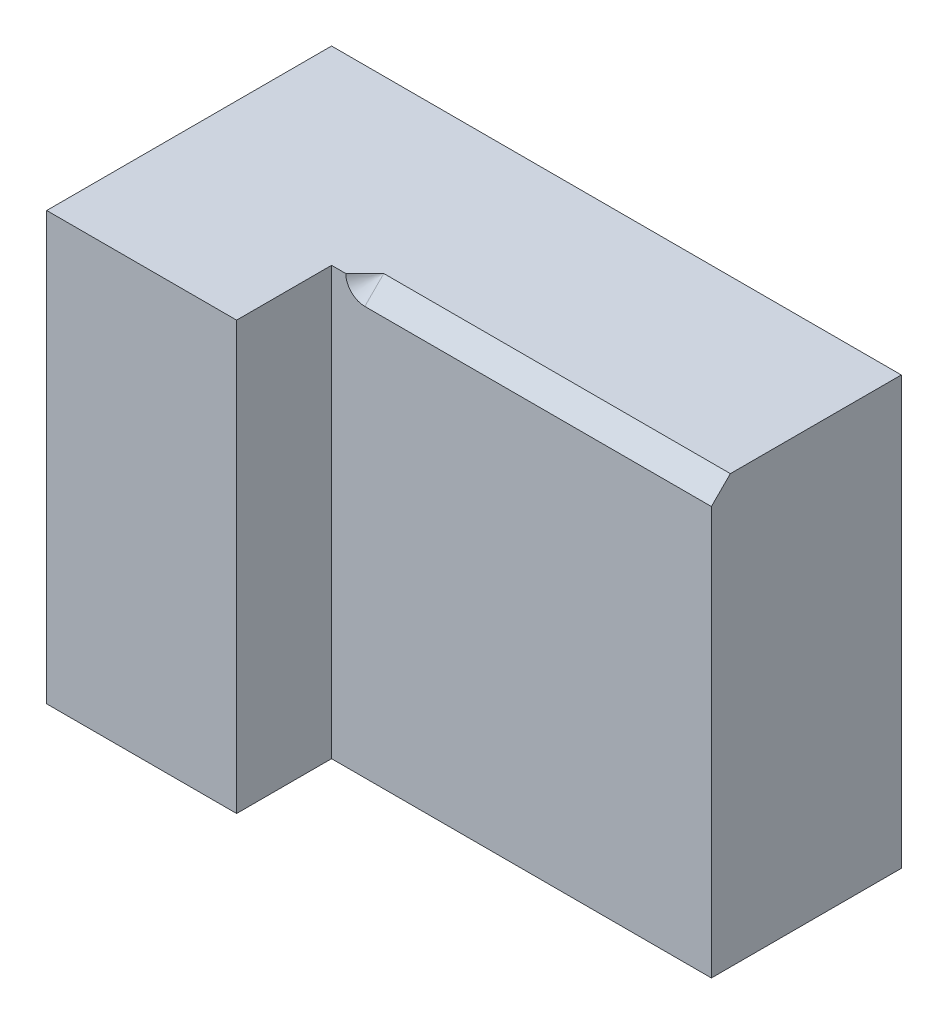
ISO-10303-21;
HEADER;
FILE_DESCRIPTION(('STEP AP214'),'2;1');
FILE_NAME('part.step','',(''),(''),'','','');
FILE_SCHEMA(('AUTOMOTIVE_DESIGN { 1 0 10303 214 1 1 1 1 }'));
ENDSEC;
DATA;
#1=APPLICATION_CONTEXT('core data for automotive mechanical design processes');
#2=APPLICATION_PROTOCOL_DEFINITION('international standard','automotive_design',2000,#1);
#3=PRODUCT_CONTEXT('',#1,'mechanical');
#4=PRODUCT('Part','Part','',(#3));
#5=PRODUCT_RELATED_PRODUCT_CATEGORY('part','',(#4));
#6=PRODUCT_DEFINITION_FORMATION('','',#4);
#7=PRODUCT_DEFINITION_CONTEXT('part definition',#1,'design');
#8=PRODUCT_DEFINITION('design','',#6,#7);
#9=PRODUCT_DEFINITION_SHAPE('','',#8);
#10=(LENGTH_UNIT() NAMED_UNIT(*) SI_UNIT(.MILLI.,.METRE.));
#11=(NAMED_UNIT(*) PLANE_ANGLE_UNIT() SI_UNIT($,.RADIAN.));
#12=(NAMED_UNIT(*) SI_UNIT($,.STERADIAN.) SOLID_ANGLE_UNIT());
#13=UNCERTAINTY_MEASURE_WITH_UNIT(LENGTH_MEASURE(1.E-05),#10,'distance_accuracy_value','');
#14=(GEOMETRIC_REPRESENTATION_CONTEXT(3) GLOBAL_UNCERTAINTY_ASSIGNED_CONTEXT((#13)) GLOBAL_UNIT_ASSIGNED_CONTEXT((#10,
#11,#12)) REPRESENTATION_CONTEXT('',''));
#15=CARTESIAN_POINT('',(0.,0.,0.));
#16=DIRECTION('',(0.,0.,1.));
#17=DIRECTION('',(1.,0.,0.));
#18=AXIS2_PLACEMENT_3D('',#15,#16,#17);
#19=CARTESIAN_POINT('',(0.,0.,20.));
#20=DIRECTION('',(0.,0.,-1.));
#21=DIRECTION('',(-1.,0.,0.));
#22=AXIS2_PLACEMENT_3D('',#19,#20,#21);
#23=PLANE('',#22);
#24=CARTESIAN_POINT('',(-6.5,20.5,20.));
#25=DIRECTION('',(1.,0.,0.));
#26=VECTOR('',#25,1.);
#27=LINE('',#24,#26);
#28=CARTESIAN_POINT('',(-6.5,20.5,20.));
#29=VERTEX_POINT('',#28);
#30=CARTESIAN_POINT('',(30.,20.5,20.));
#31=VERTEX_POINT('',#30);
#32=EDGE_CURVE('E208',#29,#31,#27,.T.);
#33=ORIENTED_EDGE('',*,*,#32,.F.);
#34=CARTESIAN_POINT('',(-6.5,22.5,20.));
#35=DIRECTION('',(0.,0.,-1.));
#36=DIRECTION('',(-1.,0.,0.));
#37=AXIS2_PLACEMENT_3D('',#34,#35,#36);
#38=CIRCLE('',#37,2.);
#39=CARTESIAN_POINT('',(-8.5,22.5,20.));
#40=VERTEX_POINT('',#39);
#41=EDGE_CURVE('E211',#29,#40,#38,.T.);
#42=ORIENTED_EDGE('',*,*,#41,.T.);
#43=DIRECTION('',(-1.,0.,0.));
#44=VECTOR('',#43,1.);
#45=CARTESIAN_POINT('',(-30.,22.5,20.));
#46=LINE('',#45,#44);
#47=CARTESIAN_POINT('',(-10.,22.5,20.));
#48=VERTEX_POINT('',#47);
#49=EDGE_CURVE('E150',#40,#48,#46,.T.);
#50=ORIENTED_EDGE('',*,*,#49,.T.);
#51=DIRECTION('',(0.,1.,0.));
#52=VECTOR('',#51,1.);
#53=CARTESIAN_POINT('',(-10.,-22.5,20.));
#54=LINE('',#53,#52);
#55=CARTESIAN_POINT('',(-10.,-22.5,20.));
#56=VERTEX_POINT('',#55);
#57=EDGE_CURVE('E70',#56,#48,#54,.T.);
#58=ORIENTED_EDGE('',*,*,#57,.F.);
#59=DIRECTION('',(1.,0.,0.));
#60=VECTOR('',#59,1.);
#61=CARTESIAN_POINT('',(-30.,-22.5,20.));
#62=LINE('',#61,#60);
#63=CARTESIAN_POINT('',(30.,-22.5,20.));
#64=VERTEX_POINT('',#63);
#65=EDGE_CURVE('E75',#56,#64,#62,.T.);
#66=ORIENTED_EDGE('',*,*,#65,.T.);
#67=DIRECTION('',(0.,1.,0.));
#68=VECTOR('',#67,1.);
#69=CARTESIAN_POINT('',(30.,-22.5,20.));
#70=LINE('',#69,#68);
#71=EDGE_CURVE('E123',#64,#31,#70,.T.);
#72=ORIENTED_EDGE('',*,*,#71,.T.);
#73=EDGE_LOOP('',(#33,#42,#50,#58,#66,#72));
#74=FACE_BOUND('',#73,.T.);
#75=ADVANCED_FACE('F47',(#74),#23,.F.);
#76=CARTESIAN_POINT('',(-30.,-22.5,20.));
#77=DIRECTION('',(1.,0.,0.));
#78=DIRECTION('',(0.,0.,-1.));
#79=AXIS2_PLACEMENT_3D('',#76,#77,#78);
#80=PLANE('',#79);
#81=DIRECTION('',(0.,-1.,0.));
#82=VECTOR('',#81,1.);
#83=CARTESIAN_POINT('',(-30.,-22.5,0.));
#84=LINE('',#83,#82);
#85=CARTESIAN_POINT('',(-30.,22.5,0.));
#86=VERTEX_POINT('',#85);
#87=CARTESIAN_POINT('',(-30.,-22.5,0.));
#88=VERTEX_POINT('',#87);
#89=EDGE_CURVE('E122',#86,#88,#84,.T.);
#90=ORIENTED_EDGE('',*,*,#89,.T.);
#91=DIRECTION('',(0.,0.,-1.));
#92=VECTOR('',#91,1.);
#93=CARTESIAN_POINT('',(-30.,-22.5,20.));
#94=LINE('',#93,#92);
#95=CARTESIAN_POINT('',(-30.,-22.5,30.));
#96=VERTEX_POINT('',#95);
#97=EDGE_CURVE('E13',#96,#88,#94,.T.);
#98=ORIENTED_EDGE('',*,*,#97,.F.);
#99=DIRECTION('',(0.,-1.,0.));
#100=VECTOR('',#99,1.);
#101=CARTESIAN_POINT('',(-30.,-22.5,30.));
#102=LINE('',#101,#100);
#103=CARTESIAN_POINT('',(-30.,22.5,30.));
#104=VERTEX_POINT('',#103);
#105=EDGE_CURVE('E250',#104,#96,#102,.T.);
#106=ORIENTED_EDGE('',*,*,#105,.F.);
#107=DIRECTION('',(0.,0.,-1.));
#108=VECTOR('',#107,1.);
#109=CARTESIAN_POINT('',(-30.,22.5,20.));
#110=LINE('',#109,#108);
#111=EDGE_CURVE('E110',#104,#86,#110,.T.);
#112=ORIENTED_EDGE('',*,*,#111,.T.);
#113=EDGE_LOOP('',(#90,#98,#106,#112));
#114=FACE_BOUND('',#113,.T.);
#115=ADVANCED_FACE('F51',(#114),#80,.F.);
#116=CARTESIAN_POINT('',(-30.,-22.5,20.));
#117=DIRECTION('',(0.,1.,0.));
#118=DIRECTION('',(0.,0.,1.));
#119=AXIS2_PLACEMENT_3D('',#116,#117,#118);
#120=PLANE('',#119);
#121=DIRECTION('',(1.,0.,0.));
#122=VECTOR('',#121,1.);
#123=CARTESIAN_POINT('',(-30.,-22.5,0.));
#124=LINE('',#123,#122);
#125=CARTESIAN_POINT('',(30.,-22.5,0.));
#126=VERTEX_POINT('',#125);
#127=EDGE_CURVE('E119',#88,#126,#124,.T.);
#128=ORIENTED_EDGE('',*,*,#127,.T.);
#129=DIRECTION('',(0.,0.,-1.));
#130=VECTOR('',#129,1.);
#131=CARTESIAN_POINT('',(30.,-22.5,20.));
#132=LINE('',#131,#130);
#133=EDGE_CURVE('E56',#64,#126,#132,.T.);
#134=ORIENTED_EDGE('',*,*,#133,.F.);
#135=ORIENTED_EDGE('',*,*,#65,.F.);
#136=DIRECTION('',(0.,0.,-1.));
#137=VECTOR('',#136,1.);
#138=CARTESIAN_POINT('',(-10.,-22.5,30.));
#139=LINE('',#138,#137);
#140=CARTESIAN_POINT('',(-10.,-22.5,30.));
#141=VERTEX_POINT('',#140);
#142=EDGE_CURVE('E148',#141,#56,#139,.T.);
#143=ORIENTED_EDGE('',*,*,#142,.F.);
#144=DIRECTION('',(1.,0.,0.));
#145=VECTOR('',#144,1.);
#146=CARTESIAN_POINT('',(-30.,-22.5,30.));
#147=LINE('',#146,#145);
#148=EDGE_CURVE('E251',#96,#141,#147,.T.);
#149=ORIENTED_EDGE('',*,*,#148,.F.);
#150=ORIENTED_EDGE('',*,*,#97,.T.);
#151=EDGE_LOOP('',(#128,#134,#135,#143,#149,#150));
#152=FACE_BOUND('',#151,.T.);
#153=ADVANCED_FACE('F178',(#152),#120,.F.);
#154=CARTESIAN_POINT('',(30.,-22.5,20.));
#155=DIRECTION('',(-1.,0.,0.));
#156=DIRECTION('',(0.,0.,1.));
#157=AXIS2_PLACEMENT_3D('',#154,#155,#156);
#158=PLANE('',#157);
#159=DIRECTION('',(0.,0.,-1.));
#160=VECTOR('',#159,1.);
#161=CARTESIAN_POINT('',(30.,22.5,20.));
#162=LINE('',#161,#160);
#163=CARTESIAN_POINT('',(30.,22.5,18.));
#164=VERTEX_POINT('',#163);
#165=CARTESIAN_POINT('',(30.,22.5,0.));
#166=VERTEX_POINT('',#165);
#167=EDGE_CURVE('E93',#164,#166,#162,.T.);
#168=ORIENTED_EDGE('',*,*,#167,.F.);
#169=DIRECTION('',(0.,-0.707106781186548,0.707106781186547));
#170=VECTOR('',#169,1.);
#171=CARTESIAN_POINT('',(30.,-1.00000000000004,41.5));
#172=LINE('',#171,#170);
#173=EDGE_CURVE('E225',#164,#31,#172,.T.);
#174=ORIENTED_EDGE('',*,*,#173,.T.);
#175=ORIENTED_EDGE('',*,*,#71,.F.);
#176=ORIENTED_EDGE('',*,*,#133,.T.);
#177=DIRECTION('',(0.,1.,0.));
#178=VECTOR('',#177,1.);
#179=CARTESIAN_POINT('',(30.,-22.5,0.));
#180=LINE('',#179,#178);
#181=EDGE_CURVE('E112',#126,#166,#180,.T.);
#182=ORIENTED_EDGE('',*,*,#181,.T.);
#183=EDGE_LOOP('',(#168,#174,#175,#176,#182));
#184=FACE_BOUND('',#183,.T.);
#185=ADVANCED_FACE('F115',(#184),#158,.F.);
#186=CARTESIAN_POINT('',(-30.,22.5,20.));
#187=DIRECTION('',(0.,-1.,0.));
#188=DIRECTION('',(0.,0.,-1.));
#189=AXIS2_PLACEMENT_3D('',#186,#187,#188);
#190=PLANE('',#189);
#191=ORIENTED_EDGE('',*,*,#49,.F.);
#192=DIRECTION('',(0.707106781186547,0.,-0.707106781186548));
#193=VECTOR('',#192,1.);
#194=CARTESIAN_POINT('',(-6.5,22.5,18.));
#195=LINE('',#194,#193);
#196=CARTESIAN_POINT('',(-6.5,22.5,18.));
#197=VERTEX_POINT('',#196);
#198=EDGE_CURVE('E52',#40,#197,#195,.T.);
#199=ORIENTED_EDGE('',*,*,#198,.T.);
#200=CARTESIAN_POINT('',(-6.5,22.5,18.));
#201=DIRECTION('',(1.,0.,0.));
#202=VECTOR('',#201,1.);
#203=LINE('',#200,#202);
#204=EDGE_CURVE('E105',#197,#164,#203,.T.);
#205=ORIENTED_EDGE('',*,*,#204,.T.);
#206=ORIENTED_EDGE('',*,*,#167,.T.);
#207=DIRECTION('',(-1.,0.,0.));
#208=VECTOR('',#207,1.);
#209=CARTESIAN_POINT('',(-30.,22.5,0.));
#210=LINE('',#209,#208);
#211=EDGE_CURVE('E100',#166,#86,#210,.T.);
#212=ORIENTED_EDGE('',*,*,#211,.T.);
#213=ORIENTED_EDGE('',*,*,#111,.F.);
#214=DIRECTION('',(-1.,0.,0.));
#215=VECTOR('',#214,1.);
#216=CARTESIAN_POINT('',(-30.,22.5,30.));
#217=LINE('',#216,#215);
#218=CARTESIAN_POINT('',(-10.,22.5,30.));
#219=VERTEX_POINT('',#218);
#220=EDGE_CURVE('E264',#219,#104,#217,.T.);
#221=ORIENTED_EDGE('',*,*,#220,.F.);
#222=DIRECTION('',(0.,0.,-1.));
#223=VECTOR('',#222,1.);
#224=CARTESIAN_POINT('',(-10.,22.5,30.));
#225=LINE('',#224,#223);
#226=EDGE_CURVE('E267',#219,#48,#225,.T.);
#227=ORIENTED_EDGE('',*,*,#226,.T.);
#228=EDGE_LOOP('',(#191,#199,#205,#206,#212,#213,#221,#227));
#229=FACE_BOUND('',#228,.T.);
#230=ADVANCED_FACE('F94',(#229),#190,.F.);
#231=CARTESIAN_POINT('',(0.,0.,0.));
#232=DIRECTION('',(0.,0.,-1.));
#233=DIRECTION('',(-1.,0.,0.));
#234=AXIS2_PLACEMENT_3D('',#231,#232,#233);
#235=PLANE('',#234);
#236=ORIENTED_EDGE('',*,*,#89,.F.);
#237=ORIENTED_EDGE('',*,*,#211,.F.);
#238=ORIENTED_EDGE('',*,*,#181,.F.);
#239=ORIENTED_EDGE('',*,*,#127,.F.);
#240=EDGE_LOOP('',(#236,#237,#238,#239));
#241=FACE_BOUND('',#240,.T.);
#242=ADVANCED_FACE('F118',(#241),#235,.T.);
#243=CARTESIAN_POINT('',(-10.,-22.5,30.));
#244=DIRECTION('',(-1.,0.,0.));
#245=DIRECTION('',(0.,0.,1.));
#246=AXIS2_PLACEMENT_3D('',#243,#244,#245);
#247=PLANE('',#246);
#248=ORIENTED_EDGE('',*,*,#57,.T.);
#249=ORIENTED_EDGE('',*,*,#226,.F.);
#250=DIRECTION('',(0.,1.,0.));
#251=VECTOR('',#250,1.);
#252=CARTESIAN_POINT('',(-10.,-22.5,30.));
#253=LINE('',#252,#251);
#254=EDGE_CURVE('E261',#141,#219,#253,.T.);
#255=ORIENTED_EDGE('',*,*,#254,.F.);
#256=ORIENTED_EDGE('',*,*,#142,.T.);
#257=EDGE_LOOP('',(#248,#249,#255,#256));
#258=FACE_BOUND('',#257,.T.);
#259=ADVANCED_FACE('F198',(#258),#247,.F.);
#260=CARTESIAN_POINT('',(0.,0.,30.));
#261=DIRECTION('',(0.,0.,-1.));
#262=DIRECTION('',(-1.,0.,0.));
#263=AXIS2_PLACEMENT_3D('',#260,#261,#262);
#264=PLANE('',#263);
#265=ORIENTED_EDGE('',*,*,#105,.T.);
#266=ORIENTED_EDGE('',*,*,#148,.T.);
#267=ORIENTED_EDGE('',*,*,#254,.T.);
#268=ORIENTED_EDGE('',*,*,#220,.T.);
#269=EDGE_LOOP('',(#265,#266,#267,#268));
#270=FACE_BOUND('',#269,.T.);
#271=ADVANCED_FACE('F298',(#270),#264,.F.);
#272=CARTESIAN_POINT('',(-6.5,20.5,20.));
#273=DIRECTION('',(0.,-0.707106781186547,-0.707106781186548));
#274=DIRECTION('',(0.,0.707106781186548,-0.707106781186547));
#275=AXIS2_PLACEMENT_3D('',#272,#273,#274);
#276=PLANE('',#275);
#277=ORIENTED_EDGE('',*,*,#204,.F.);
#278=DIRECTION('',(0.,0.707106781186548,-0.707106781186547));
#279=VECTOR('',#278,1.);
#280=CARTESIAN_POINT('',(-6.5,20.5,20.));
#281=LINE('',#280,#279);
#282=EDGE_CURVE('E218',#29,#197,#281,.T.);
#283=ORIENTED_EDGE('',*,*,#282,.F.);
#284=ORIENTED_EDGE('',*,*,#32,.T.);
#285=ORIENTED_EDGE('',*,*,#173,.F.);
#286=EDGE_LOOP('',(#277,#283,#284,#285));
#287=FACE_BOUND('',#286,.T.);
#288=ADVANCED_FACE('F303',(#287),#276,.F.);
#289=CARTESIAN_POINT('',(-6.5,22.5,18.));
#290=DIRECTION('',(0.,0.,1.));
#291=DIRECTION('',(1.,0.,0.));
#292=AXIS2_PLACEMENT_3D('',#289,#290,#291);
#293=CONICAL_SURFACE('',#292,0.,0.785398163397448);
#294=ORIENTED_EDGE('',*,*,#282,.T.);
#295=ORIENTED_EDGE('',*,*,#198,.F.);
#296=ORIENTED_EDGE('',*,*,#41,.F.);
#297=EDGE_LOOP('',(#294,#295,#296));
#298=FACE_BOUND('',#297,.T.);
#299=ADVANCED_FACE('F310',(#298),#293,.F.);
#300=CLOSED_SHELL('',(#75,#115,#153,#185,#230,#242,#259,#271,#288,#299));
#301=MANIFOLD_SOLID_BREP('B2',#300);
#302=ADVANCED_BREP_SHAPE_REPRESENTATION('',(#18,#301),#14);
#303=SHAPE_DEFINITION_REPRESENTATION(#9,#302);
ENDSEC;
END-ISO-10303-21;
